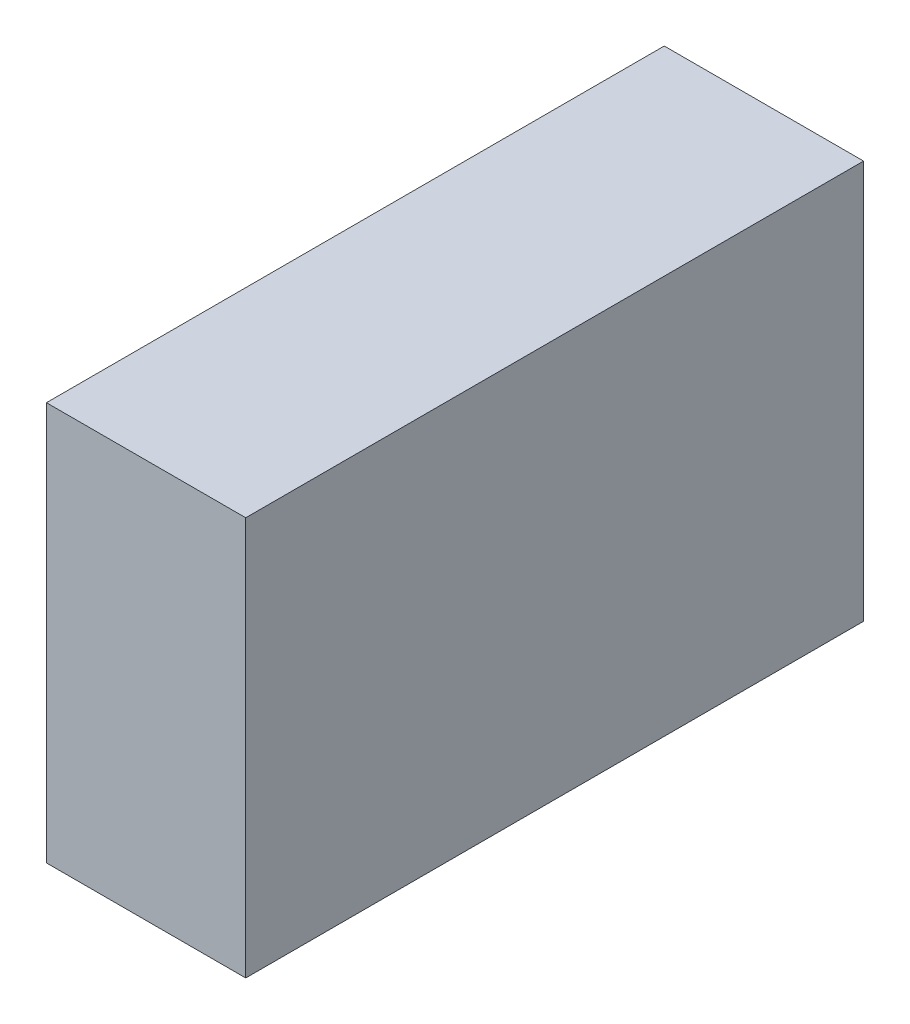
ISO-10303-21;
HEADER;
FILE_DESCRIPTION(('STEP AP214'),'2;1');
FILE_NAME('part.step','',(''),(''),'','','');
FILE_SCHEMA(('AUTOMOTIVE_DESIGN { 1 0 10303 214 1 1 1 1 }'));
ENDSEC;
DATA;
#1=APPLICATION_CONTEXT('core data for automotive mechanical design processes');
#2=APPLICATION_PROTOCOL_DEFINITION('international standard','automotive_design',2000,#1);
#3=PRODUCT_CONTEXT('',#1,'mechanical');
#4=PRODUCT('Part','Part','',(#3));
#5=PRODUCT_RELATED_PRODUCT_CATEGORY('part','',(#4));
#6=PRODUCT_DEFINITION_FORMATION('','',#4);
#7=PRODUCT_DEFINITION_CONTEXT('part definition',#1,'design');
#8=PRODUCT_DEFINITION('design','',#6,#7);
#9=PRODUCT_DEFINITION_SHAPE('','',#8);
#10=(LENGTH_UNIT() NAMED_UNIT(*) SI_UNIT(.MILLI.,.METRE.));
#11=(NAMED_UNIT(*) PLANE_ANGLE_UNIT() SI_UNIT($,.RADIAN.));
#12=(NAMED_UNIT(*) SI_UNIT($,.STERADIAN.) SOLID_ANGLE_UNIT());
#13=UNCERTAINTY_MEASURE_WITH_UNIT(LENGTH_MEASURE(1.E-05),#10,'distance_accuracy_value','');
#14=(GEOMETRIC_REPRESENTATION_CONTEXT(3) GLOBAL_UNCERTAINTY_ASSIGNED_CONTEXT((#13)) GLOBAL_UNIT_ASSIGNED_CONTEXT((#10,
#11,#12)) REPRESENTATION_CONTEXT('',''));
#15=CARTESIAN_POINT('',(0.,0.,0.));
#16=DIRECTION('',(0.,0.,1.));
#17=DIRECTION('',(1.,0.,0.));
#18=AXIS2_PLACEMENT_3D('',#15,#16,#17);
#19=CARTESIAN_POINT('',(-10.,0.,0.));
#20=DIRECTION('',(0.,0.,1.));
#21=DIRECTION('',(1.,0.,0.));
#22=AXIS2_PLACEMENT_3D('',#19,#20,#21);
#23=PLANE('',#22);
#24=DIRECTION('',(0.,-1.,0.));
#25=VECTOR('',#24,1.);
#26=CARTESIAN_POINT('',(0.,0.,0.));
#27=LINE('',#26,#25);
#28=CARTESIAN_POINT('',(0.,20.,0.));
#29=VERTEX_POINT('',#28);
#30=CARTESIAN_POINT('',(0.,0.,0.));
#31=VERTEX_POINT('',#30);
#32=EDGE_CURVE('E104',#29,#31,#27,.T.);
#33=ORIENTED_EDGE('',*,*,#32,.F.);
#34=DIRECTION('',(1.,0.,0.));
#35=VECTOR('',#34,1.);
#36=CARTESIAN_POINT('',(-10.,20.,0.));
#37=LINE('',#36,#35);
#38=CARTESIAN_POINT('',(-10.,20.,0.));
#39=VERTEX_POINT('',#38);
#40=EDGE_CURVE('E11',#39,#29,#37,.T.);
#41=ORIENTED_EDGE('',*,*,#40,.F.);
#42=DIRECTION('',(0.,-1.,0.));
#43=VECTOR('',#42,1.);
#44=CARTESIAN_POINT('',(-10.,0.,0.));
#45=LINE('',#44,#43);
#46=CARTESIAN_POINT('',(-10.,0.,0.));
#47=VERTEX_POINT('',#46);
#48=EDGE_CURVE('E100',#39,#47,#45,.T.);
#49=ORIENTED_EDGE('',*,*,#48,.T.);
#50=DIRECTION('',(1.,0.,0.));
#51=VECTOR('',#50,1.);
#52=CARTESIAN_POINT('',(-10.,0.,0.));
#53=LINE('',#52,#51);
#54=EDGE_CURVE('E45',#47,#31,#53,.T.);
#55=ORIENTED_EDGE('',*,*,#54,.T.);
#56=EDGE_LOOP('',(#33,#41,#49,#55));
#57=FACE_BOUND('',#56,.T.);
#58=ADVANCED_FACE('F39',(#57),#23,.T.);
#59=CARTESIAN_POINT('',(-10.,20.,0.));
#60=DIRECTION('',(0.,1.,0.));
#61=DIRECTION('',(0.,0.,1.));
#62=AXIS2_PLACEMENT_3D('',#59,#60,#61);
#63=PLANE('',#62);
#64=DIRECTION('',(0.,0.,1.));
#65=VECTOR('',#64,1.);
#66=CARTESIAN_POINT('',(0.,20.,0.));
#67=LINE('',#66,#65);
#68=CARTESIAN_POINT('',(0.,20.,-31.));
#69=VERTEX_POINT('',#68);
#70=EDGE_CURVE('E98',#69,#29,#67,.T.);
#71=ORIENTED_EDGE('',*,*,#70,.F.);
#72=DIRECTION('',(1.,0.,0.));
#73=VECTOR('',#72,1.);
#74=CARTESIAN_POINT('',(-10.,20.,-31.));
#75=LINE('',#74,#73);
#76=CARTESIAN_POINT('',(-10.,20.,-31.));
#77=VERTEX_POINT('',#76);
#78=EDGE_CURVE('E48',#77,#69,#75,.T.);
#79=ORIENTED_EDGE('',*,*,#78,.F.);
#80=DIRECTION('',(0.,0.,1.));
#81=VECTOR('',#80,1.);
#82=CARTESIAN_POINT('',(-10.,20.,0.));
#83=LINE('',#82,#81);
#84=EDGE_CURVE('E92',#77,#39,#83,.T.);
#85=ORIENTED_EDGE('',*,*,#84,.T.);
#86=ORIENTED_EDGE('',*,*,#40,.T.);
#87=EDGE_LOOP('',(#71,#79,#85,#86));
#88=FACE_BOUND('',#87,.T.);
#89=ADVANCED_FACE('F111',(#88),#63,.T.);
#90=CARTESIAN_POINT('',(-10.,0.,-31.));
#91=DIRECTION('',(0.,0.,-1.));
#92=DIRECTION('',(-1.,0.,0.));
#93=AXIS2_PLACEMENT_3D('',#90,#91,#92);
#94=PLANE('',#93);
#95=DIRECTION('',(0.,1.,0.));
#96=VECTOR('',#95,1.);
#97=CARTESIAN_POINT('',(0.,0.,-31.));
#98=LINE('',#97,#96);
#99=CARTESIAN_POINT('',(0.,0.,-31.));
#100=VERTEX_POINT('',#99);
#101=EDGE_CURVE('E87',#100,#69,#98,.T.);
#102=ORIENTED_EDGE('',*,*,#101,.F.);
#103=DIRECTION('',(1.,0.,0.));
#104=VECTOR('',#103,1.);
#105=CARTESIAN_POINT('',(-10.,0.,-31.));
#106=LINE('',#105,#104);
#107=CARTESIAN_POINT('',(-10.,0.,-31.));
#108=VERTEX_POINT('',#107);
#109=EDGE_CURVE('E84',#108,#100,#106,.T.);
#110=ORIENTED_EDGE('',*,*,#109,.F.);
#111=DIRECTION('',(0.,1.,0.));
#112=VECTOR('',#111,1.);
#113=CARTESIAN_POINT('',(-10.,0.,-31.));
#114=LINE('',#113,#112);
#115=EDGE_CURVE('E90',#108,#77,#114,.T.);
#116=ORIENTED_EDGE('',*,*,#115,.T.);
#117=ORIENTED_EDGE('',*,*,#78,.T.);
#118=EDGE_LOOP('',(#102,#110,#116,#117));
#119=FACE_BOUND('',#118,.T.);
#120=ADVANCED_FACE('F86',(#119),#94,.T.);
#121=CARTESIAN_POINT('',(-10.,0.,0.));
#122=DIRECTION('',(0.,-1.,0.));
#123=DIRECTION('',(0.,0.,-1.));
#124=AXIS2_PLACEMENT_3D('',#121,#122,#123);
#125=PLANE('',#124);
#126=DIRECTION('',(0.,0.,-1.));
#127=VECTOR('',#126,1.);
#128=CARTESIAN_POINT('',(0.,0.,0.));
#129=LINE('',#128,#127);
#130=EDGE_CURVE('E106',#31,#100,#129,.T.);
#131=ORIENTED_EDGE('',*,*,#130,.F.);
#132=ORIENTED_EDGE('',*,*,#54,.F.);
#133=DIRECTION('',(0.,0.,-1.));
#134=VECTOR('',#133,1.);
#135=CARTESIAN_POINT('',(-10.,0.,0.));
#136=LINE('',#135,#134);
#137=EDGE_CURVE('E93',#47,#108,#136,.T.);
#138=ORIENTED_EDGE('',*,*,#137,.T.);
#139=ORIENTED_EDGE('',*,*,#109,.T.);
#140=EDGE_LOOP('',(#131,#132,#138,#139));
#141=FACE_BOUND('',#140,.T.);
#142=ADVANCED_FACE('F96',(#141),#125,.T.);
#143=CARTESIAN_POINT('',(-10.,0.,0.));
#144=DIRECTION('',(-1.,0.,0.));
#145=DIRECTION('',(0.,0.,1.));
#146=AXIS2_PLACEMENT_3D('',#143,#144,#145);
#147=PLANE('',#146);
#148=ORIENTED_EDGE('',*,*,#48,.F.);
#149=ORIENTED_EDGE('',*,*,#84,.F.);
#150=ORIENTED_EDGE('',*,*,#115,.F.);
#151=ORIENTED_EDGE('',*,*,#137,.F.);
#152=EDGE_LOOP('',(#148,#149,#150,#151));
#153=FACE_BOUND('',#152,.T.);
#154=ADVANCED_FACE('F95',(#153),#147,.T.);
#155=CARTESIAN_POINT('',(0.,0.,0.));
#156=DIRECTION('',(-1.,0.,0.));
#157=DIRECTION('',(0.,0.,1.));
#158=AXIS2_PLACEMENT_3D('',#155,#156,#157);
#159=PLANE('',#158);
#160=ORIENTED_EDGE('',*,*,#32,.T.);
#161=ORIENTED_EDGE('',*,*,#130,.T.);
#162=ORIENTED_EDGE('',*,*,#101,.T.);
#163=ORIENTED_EDGE('',*,*,#70,.T.);
#164=EDGE_LOOP('',(#160,#161,#162,#163));
#165=FACE_BOUND('',#164,.T.);
#166=ADVANCED_FACE('F115',(#165),#159,.F.);
#167=CLOSED_SHELL('',(#58,#89,#120,#142,#154,#166));
#168=MANIFOLD_SOLID_BREP('B2',#167);
#169=ADVANCED_BREP_SHAPE_REPRESENTATION('',(#18,#168),#14);
#170=SHAPE_DEFINITION_REPRESENTATION(#9,#169);
ENDSEC;
END-ISO-10303-21;
